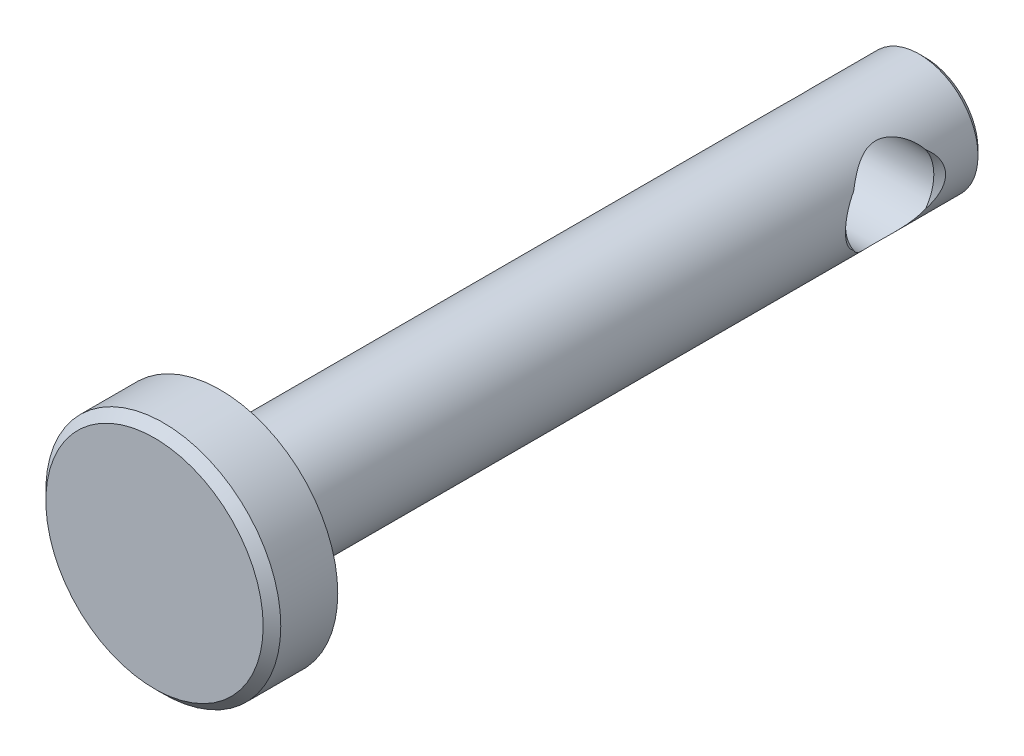
ISO-10303-21;
HEADER;
FILE_DESCRIPTION(('STEP AP214'),'2;1');
FILE_NAME('part.step','',(''),(''),'','','');
FILE_SCHEMA(('AUTOMOTIVE_DESIGN { 1 0 10303 214 1 1 1 1 }'));
ENDSEC;
DATA;
#1=APPLICATION_CONTEXT('core data for automotive mechanical design processes');
#2=APPLICATION_PROTOCOL_DEFINITION('international standard','automotive_design',2000,#1);
#3=PRODUCT_CONTEXT('',#1,'mechanical');
#4=PRODUCT('Part','Part','',(#3));
#5=PRODUCT_RELATED_PRODUCT_CATEGORY('part','',(#4));
#6=PRODUCT_DEFINITION_FORMATION('','',#4);
#7=PRODUCT_DEFINITION_CONTEXT('part definition',#1,'design');
#8=PRODUCT_DEFINITION('design','',#6,#7);
#9=PRODUCT_DEFINITION_SHAPE('','',#8);
#10=(LENGTH_UNIT() NAMED_UNIT(*) SI_UNIT(.MILLI.,.METRE.));
#11=(NAMED_UNIT(*) PLANE_ANGLE_UNIT() SI_UNIT($,.RADIAN.));
#12=(NAMED_UNIT(*) SI_UNIT($,.STERADIAN.) SOLID_ANGLE_UNIT());
#13=UNCERTAINTY_MEASURE_WITH_UNIT(LENGTH_MEASURE(1.E-05),#10,'distance_accuracy_value','');
#14=(GEOMETRIC_REPRESENTATION_CONTEXT(3) GLOBAL_UNCERTAINTY_ASSIGNED_CONTEXT((#13)) GLOBAL_UNIT_ASSIGNED_CONTEXT((#10,
#11,#12)) REPRESENTATION_CONTEXT('',''));
#15=CARTESIAN_POINT('',(0.,0.,0.));
#16=DIRECTION('',(0.,0.,1.));
#17=DIRECTION('',(1.,0.,0.));
#18=AXIS2_PLACEMENT_3D('',#15,#16,#17);
#19=CARTESIAN_POINT('',(0.,1.5875,8.636));
#20=DIRECTION('',(0.,0.,1.));
#21=DIRECTION('',(1.,0.,0.));
#22=AXIS2_PLACEMENT_3D('',#19,#20,#21);
#23=PLANE('',#22);
#24=CARTESIAN_POINT('',(0.,0.,8.636));
#25=DIRECTION('',(0.,0.,1.));
#26=DIRECTION('',(1.,0.,0.));
#27=AXIS2_PLACEMENT_3D('',#24,#25,#26);
#28=CIRCLE('',#27,1.7065625);
#29=CARTESIAN_POINT('',(1.7065625,0.,8.636));
#30=VERTEX_POINT('',#29);
#31=EDGE_CURVE('E121',#30,#30,#28,.T.);
#32=ORIENTED_EDGE('',*,*,#31,.T.);
#33=EDGE_LOOP('',(#32));
#34=FACE_BOUND('',#33,.T.);
#35=CARTESIAN_POINT('',(0.,0.,8.636));
#36=DIRECTION('',(0.,0.,1.));
#37=DIRECTION('',(1.,0.,0.));
#38=AXIS2_PLACEMENT_3D('',#35,#36,#37);
#39=CIRCLE('',#38,3.175);
#40=CARTESIAN_POINT('',(3.175,0.,8.636));
#41=VERTEX_POINT('',#40);
#42=EDGE_CURVE('E173',#41,#41,#39,.T.);
#43=ORIENTED_EDGE('',*,*,#42,.F.);
#44=EDGE_LOOP('',(#43));
#45=FACE_BOUND('',#44,.T.);
#46=ADVANCED_FACE('F43',(#34,#45),#23,.F.);
#47=CARTESIAN_POINT('',(0.,0.,10.414));
#48=DIRECTION('',(0.,0.,1.));
#49=DIRECTION('',(1.,0.,0.));
#50=AXIS2_PLACEMENT_3D('',#47,#48,#49);
#51=CYLINDRICAL_SURFACE('',#50,3.175);
#52=CARTESIAN_POINT('',(0.,0.,10.175875));
#53=DIRECTION('',(0.,0.,1.));
#54=DIRECTION('',(1.,0.,0.));
#55=AXIS2_PLACEMENT_3D('',#52,#53,#54);
#56=CIRCLE('',#55,3.175);
#57=CARTESIAN_POINT('',(3.175,0.,10.175875));
#58=VERTEX_POINT('',#57);
#59=EDGE_CURVE('E170',#58,#58,#56,.T.);
#60=ORIENTED_EDGE('',*,*,#59,.F.);
#61=EDGE_LOOP('',(#60));
#62=FACE_BOUND('',#61,.T.);
#63=ORIENTED_EDGE('',*,*,#42,.T.);
#64=EDGE_LOOP('',(#63));
#65=FACE_BOUND('',#64,.T.);
#66=ADVANCED_FACE('F194',(#62,#65),#51,.T.);
#67=CARTESIAN_POINT('',(0.,0.,10.175875));
#68=DIRECTION('',(0.,0.,-1.));
#69=DIRECTION('',(-1.,0.,0.));
#70=AXIS2_PLACEMENT_3D('',#67,#68,#69);
#71=CONICAL_SURFACE('',#70,3.175,0.78539816339745);
#72=CARTESIAN_POINT('',(0.,0.,10.414));
#73=DIRECTION('',(0.,0.,1.));
#74=DIRECTION('',(1.,0.,0.));
#75=AXIS2_PLACEMENT_3D('',#72,#73,#74);
#76=CIRCLE('',#75,2.936875);
#77=CARTESIAN_POINT('',(2.936875,0.,10.414));
#78=VERTEX_POINT('',#77);
#79=EDGE_CURVE('E166',#78,#78,#76,.T.);
#80=ORIENTED_EDGE('',*,*,#79,.F.);
#81=EDGE_LOOP('',(#80));
#82=FACE_BOUND('',#81,.T.);
#83=ORIENTED_EDGE('',*,*,#59,.T.);
#84=EDGE_LOOP('',(#83));
#85=FACE_BOUND('',#84,.T.);
#86=ADVANCED_FACE('F199',(#82,#85),#71,.T.);
#87=CARTESIAN_POINT('',(0.,2.936875,10.414));
#88=DIRECTION('',(0.,0.,-1.));
#89=DIRECTION('',(-1.,0.,0.));
#90=AXIS2_PLACEMENT_3D('',#87,#88,#89);
#91=PLANE('',#90);
#92=ORIENTED_EDGE('',*,*,#79,.T.);
#93=EDGE_LOOP('',(#92));
#94=FACE_BOUND('',#93,.T.);
#95=ADVANCED_FACE('F206',(#94),#91,.F.);
#96=CARTESIAN_POINT('',(0.,0.,-10.414));
#97=DIRECTION('',(0.,0.,1.));
#98=DIRECTION('',(1.,0.,0.));
#99=AXIS2_PLACEMENT_3D('',#96,#97,#98);
#100=PLANE('',#99);
#101=CARTESIAN_POINT('',(0.,0.,-10.414));
#102=DIRECTION('',(0.,0.,1.));
#103=DIRECTION('',(1.,0.,0.));
#104=AXIS2_PLACEMENT_3D('',#101,#102,#103);
#105=CIRCLE('',#104,1.42875);
#106=CARTESIAN_POINT('',(1.42875,0.,-10.414));
#107=VERTEX_POINT('',#106);
#108=EDGE_CURVE('E106',#107,#107,#105,.T.);
#109=ORIENTED_EDGE('',*,*,#108,.F.);
#110=EDGE_LOOP('',(#109));
#111=FACE_BOUND('',#110,.T.);
#112=ADVANCED_FACE('F210',(#111),#100,.F.);
#113=CARTESIAN_POINT('',(0.,0.,-10.414));
#114=DIRECTION('',(0.,0.,1.));
#115=DIRECTION('',(1.,0.,0.));
#116=AXIS2_PLACEMENT_3D('',#113,#114,#115);
#117=CONICAL_SURFACE('',#116,1.42875,0.78539816339745);
#118=CARTESIAN_POINT('',(0.,0.,-10.25525));
#119=DIRECTION('',(0.,0.,1.));
#120=DIRECTION('',(1.,0.,0.));
#121=AXIS2_PLACEMENT_3D('',#118,#119,#120);
#122=CIRCLE('',#121,1.5875);
#123=CARTESIAN_POINT('',(1.5875,0.,-10.25525));
#124=VERTEX_POINT('',#123);
#125=EDGE_CURVE('E101',#124,#124,#122,.T.);
#126=ORIENTED_EDGE('',*,*,#125,.F.);
#127=EDGE_LOOP('',(#126));
#128=FACE_BOUND('',#127,.T.);
#129=ORIENTED_EDGE('',*,*,#108,.T.);
#130=EDGE_LOOP('',(#129));
#131=FACE_BOUND('',#130,.T.);
#132=ADVANCED_FACE('F213',(#128,#131),#117,.T.);
#133=CARTESIAN_POINT('',(0.,0.,10.414));
#134=DIRECTION('',(0.,0.,1.));
#135=DIRECTION('',(1.,0.,0.));
#136=AXIS2_PLACEMENT_3D('',#133,#134,#135);
#137=CYLINDRICAL_SURFACE('',#136,1.5875);
#138=CARTESIAN_POINT('',(0.,0.,8.5169375));
#139=DIRECTION('',(0.,0.,1.));
#140=DIRECTION('',(1.,0.,0.));
#141=AXIS2_PLACEMENT_3D('',#138,#139,#140);
#142=CIRCLE('',#141,1.5875);
#143=CARTESIAN_POINT('',(1.5875,0.,8.5169375));
#144=VERTEX_POINT('',#143);
#145=EDGE_CURVE('E98',#144,#144,#142,.F.);
#146=ORIENTED_EDGE('',*,*,#145,.T.);
#147=EDGE_LOOP('',(#146));
#148=FACE_BOUND('',#147,.T.);
#149=CARTESIAN_POINT('',(1.5875,0.,-9.2202));
#150=CARTESIAN_POINT('',(1.58749611202196,-0.0582400089712499,-9.22019595126899));
#151=CARTESIAN_POINT('',(1.58426132337949,-0.11657109258843,-9.2159035448831));
#152=CARTESIAN_POINT('',(1.57161329724713,-0.231395079350689,-9.19900427951974));
#153=CARTESIAN_POINT('',(1.56218511689412,-0.287883189061273,-9.1863773112997));
#154=CARTESIAN_POINT('',(1.53805521874965,-0.397051087064886,-9.15366970328841));
#155=CARTESIAN_POINT('',(1.52338545829253,-0.449751678169738,-9.13363420719449));
#156=CARTESIAN_POINT('',(1.48987548341856,-0.550689971898322,-9.08705653326953));
#157=CARTESIAN_POINT('',(1.4710363761734,-0.598928854517485,-9.06051608263106));
#158=CARTESIAN_POINT('',(1.42848471386698,-0.6946800051158,-8.99908127379585));
#159=CARTESIAN_POINT('',(1.40448224261949,-0.741710122532747,-8.9636404849278));
#160=CARTESIAN_POINT('',(1.35445854154791,-0.829553943149394,-8.88687000646612));
#161=CARTESIAN_POINT('',(1.32843424535869,-0.870357914423511,-8.8455312892167));
#162=CARTESIAN_POINT('',(1.27068479738001,-0.953179932306108,-8.74853000227194));
#163=CARTESIAN_POINT('',(1.23888117921051,-0.993742907098832,-8.69166648702831));
#164=CARTESIAN_POINT('',(1.17827563549305,-1.06489206788819,-8.57053659887598));
#165=CARTESIAN_POINT('',(1.14946970080027,-1.09549169878323,-8.50628036187352));
#166=CARTESIAN_POINT('',(1.10835974170722,-1.13676501194143,-8.39403974300635));
#167=CARTESIAN_POINT('',(1.09379064722667,-1.1506712140752,-8.34808519536583));
#168=CARTESIAN_POINT('',(1.06983233223605,-1.17298121093543,-8.25359840345064));
#169=CARTESIAN_POINT('',(1.06043121477498,-1.1813976517873,-8.20507236388544));
#170=CARTESIAN_POINT('',(1.04829075745166,-1.19218967004259,-8.10602411547749));
#171=CARTESIAN_POINT('',(1.045613069014,-1.19450935132434,-8.05548771916016));
#172=CARTESIAN_POINT('',(1.04766413974654,-1.19270985237305,-7.95467152282419));
#173=CARTESIAN_POINT('',(1.0523953756061,-1.18858851900885,-7.90439181424972));
#174=CARTESIAN_POINT('',(1.06743533103032,-1.17508360539052,-7.81119140318832));
#175=CARTESIAN_POINT('',(1.07708192277861,-1.16632068351073,-7.76806484052093));
#176=CARTESIAN_POINT('',(1.10026903393579,-1.14447308122112,-7.68401397501192));
#177=CARTESIAN_POINT('',(1.11381333728094,-1.13138419928487,-7.64309185832182));
#178=CARTESIAN_POINT('',(1.15290197907028,-1.09185551143223,-7.53875648839986));
#179=CARTESIAN_POINT('',(1.18063622025076,-1.06219612507048,-7.4773835414864));
#180=CARTESIAN_POINT('',(1.23884845074039,-0.993702457646828,-7.36136751735191));
#181=CARTESIAN_POINT('',(1.26933302873675,-0.954845761924141,-7.30674138563403));
#182=CARTESIAN_POINT('',(1.33071770954226,-0.867340615100043,-7.20324517466848));
#183=CARTESIAN_POINT('',(1.36160815500153,-0.818464823163803,-7.15456060007206));
#184=CARTESIAN_POINT('',(1.42018729468899,-0.711972733099049,-7.0656470556378));
#185=CARTESIAN_POINT('',(1.44788202748534,-0.654373411630238,-7.0254020168846));
#186=CARTESIAN_POINT('',(1.49255937974569,-0.543375678884244,-6.96191225720353));
#187=CARTESIAN_POINT('',(1.51057698528298,-0.491421390850431,-6.93687826342951));
#188=CARTESIAN_POINT('',(1.54160267629901,-0.383120959812397,-6.89425356935758));
#189=CARTESIAN_POINT('',(1.55461387180883,-0.326777569607643,-6.87665824741071));
#190=CARTESIAN_POINT('',(1.57456526025464,-0.210682235925699,-6.84982044867307));
#191=CARTESIAN_POINT('',(1.58146728549932,-0.150911313378105,-6.84063047346514));
#192=CARTESIAN_POINT('',(1.58835864577547,-0.0302752509871145,-6.83145425719974));
#193=CARTESIAN_POINT('',(1.58835103325544,0.030589393802899,-6.83146395203366));
#194=CARTESIAN_POINT('',(1.58179458772454,0.1450181185284,-6.8401950465413));
#195=CARTESIAN_POINT('',(1.57591384970658,0.19869298501823,-6.84802667096197));
#196=CARTESIAN_POINT('',(1.55908265824008,0.303723073443524,-6.87063283096421));
#197=CARTESIAN_POINT('',(1.54813114648294,0.355077808693233,-6.88540881589571));
#198=CARTESIAN_POINT('',(1.52151176197059,0.456045209324179,-6.92179181647819));
#199=CARTESIAN_POINT('',(1.50569808574506,0.505541757920198,-6.94361122968309));
#200=CARTESIAN_POINT('',(1.47055050484394,0.600156812323758,-6.99304500560874));
#201=CARTESIAN_POINT('',(1.45121610643685,0.645274702724317,-7.02066018118617));
#202=CARTESIAN_POINT('',(1.40668133727199,0.73787711046835,-7.08596374763362));
#203=CARTESIAN_POINT('',(1.38104027666391,0.784504868153515,-7.12456377637796));
#204=CARTESIAN_POINT('',(1.32814791913206,0.871068853718403,-7.20785561536308));
#205=CARTESIAN_POINT('',(1.30089319575511,0.910990097537656,-7.25256067248153));
#206=CARTESIAN_POINT('',(1.24150416985764,0.99082826486013,-7.35668225605029));
#207=CARTESIAN_POINT('',(1.20943783950672,1.02927233640271,-7.41727531880507));
#208=CARTESIAN_POINT('',(1.14994929880445,1.09532583053487,-7.54615948433145));
#209=CARTESIAN_POINT('',(1.12251399992912,1.12296608908655,-7.6144279512821));
#210=CARTESIAN_POINT('',(1.08675452907574,1.15736064850765,-7.73013915267305));
#211=CARTESIAN_POINT('',(1.07514574754346,1.16805755109583,-7.77538061837333));
#212=CARTESIAN_POINT('',(1.05740659988992,1.18414258325224,-7.86779964886528));
#213=CARTESIAN_POINT('',(1.05126379878151,1.18954276562459,-7.91497256237221));
#214=CARTESIAN_POINT('',(1.04546055627039,1.19464934449511,-8.01030578195791));
#215=CARTESIAN_POINT('',(1.04583560652376,1.19432456673064,-8.05847006675175));
#216=CARTESIAN_POINT('',(1.05308483711194,1.18793443725808,-8.15394137853598));
#217=CARTESIAN_POINT('',(1.05996708886521,1.18186195618975,-8.20124726650406));
#218=CARTESIAN_POINT('',(1.08105685565804,1.16263091032964,-8.30330860189891));
#219=CARTESIAN_POINT('',(1.09648769678382,1.14826379093168,-8.35757395089954));
#220=CARTESIAN_POINT('',(1.13243372364885,1.11282760223121,-8.46210253452145));
#221=CARTESIAN_POINT('',(1.15296179012186,1.09174151519866,-8.51235519721814));
#222=CARTESIAN_POINT('',(1.20451193671736,1.03501018570489,-8.62576996395814));
#223=CARTESIAN_POINT('',(1.23666801369922,0.996854275300433,-8.68715774854217));
#224=CARTESIAN_POINT('',(1.30163587572989,0.910405116618211,-8.80195536893352));
#225=CARTESIAN_POINT('',(1.33444825342698,0.862102293520954,-8.85535758734926));
#226=CARTESIAN_POINT('',(1.39773998562555,0.755232813325329,-8.95381974105773));
#227=CARTESIAN_POINT('',(1.42819461464791,0.69657427501949,-8.99879687060098));
#228=CARTESIAN_POINT('',(1.48324162953063,0.569981739920326,-9.07797688846189));
#229=CARTESIAN_POINT('',(1.50784795580836,0.502070419774359,-9.11220546169502));
#230=CARTESIAN_POINT('',(1.54233051377999,0.379688308077726,-9.1595203293115));
#231=CARTESIAN_POINT('',(1.55440989792483,0.327083173676254,-9.17586169968433));
#232=CARTESIAN_POINT('',(1.57322723786403,0.219278478888826,-9.20118501708733));
#233=CARTESIAN_POINT('',(1.57997976971978,0.164086439239056,-9.21018704929824));
#234=CARTESIAN_POINT('',(1.58502674119598,0.0904161718022083,-9.21690930618343));
#235=CARTESIAN_POINT('',(1.58595256159585,0.0723713822538822,-9.21814159894565));
#236=CARTESIAN_POINT('',(1.58718985023469,0.0362206722883149,-9.21978764823282));
#237=CARTESIAN_POINT('',(1.58750120930128,0.0181147415803484,-9.22020125930125));
#238=CARTESIAN_POINT('',(1.5875,0.,-9.2202));
#239=B_SPLINE_CURVE_WITH_KNOTS('',3,(#149,#150,#151,#152,#153,#154,#155,#156,#157,#158,#159,
#160,#161,#162,#163,#164,#165,#166,#167,#168,#169,#170,#171,#172,#173,#174,#175,#176,#177,#178,
#179,#180,#181,#182,#183,#184,#185,#186,#187,#188,#189,#190,#191,#192,#193,#194,#195,#196,#197,
#198,#199,#200,#201,#202,#203,#204,#205,#206,#207,#208,#209,#210,#211,#212,#213,#214,#215,#216,
#217,#218,#219,#220,#221,#222,#223,#224,#225,#226,#227,#228,#229,#230,#231,#232,#233,#234,#235,
#236,#237,#238),.UNSPECIFIED.,.T.,.F.,(4,2,2,2,2,2,2,2,2,2,2,2,2,2,2,2,2,2,2,2,2,2,2,2,2,2,2,2,
2,2,2,2,2,2,2,2,2,2,2,2,2,2,2,2,4),(0.,0.1746409477453,0.349704808862343,0.523719044210978,
0.697687125338504,0.887786772593079,1.07818058109092,1.30747198334326,1.53645267659189,
1.68647155013404,1.83614361058132,1.98718317892457,2.13827324824999,2.27294091295011,
2.40773975793311,2.62731202673711,2.84742502470235,3.07323328607394,3.29860762349453,
3.47914313832493,3.65956632095647,3.84110891835788,4.02257131630786,4.18550204838064,
4.34846680066057,4.51689478880588,4.68534641481021,4.88184568379422,5.0787783058004,
5.31352668791231,5.54760007750781,5.69082209572997,5.83371744771565,5.97739115040064,
6.12124329753643,6.29493375520328,6.46906767851779,6.70520286421156,6.94156188058405,
7.18013431619471,7.4181322390808,7.58663566986344,7.75467640351593,7.80898638330886,
7.86330601157875),.UNSPECIFIED.);
#240=CARTESIAN_POINT('',(1.42875,0.691975207287083,-7.05360569877286));
#241=VERTEX_POINT('',#240);
#242=CARTESIAN_POINT('',(1.42875,0.691975207287082,-8.99919430122714));
#243=VERTEX_POINT('',#242);
#244=EDGE_CURVE('E90',#241,#243,#239,.T.);
#245=ORIENTED_EDGE('',*,*,#244,.T.);
#246=CARTESIAN_POINT('',(1.23805,0.99367421597825,-8.16359024199999));
#247=CARTESIAN_POINT('',(1.24053479299915,0.990561992498934,-8.20440734850049));
#248=CARTESIAN_POINT('',(1.2441425338152,0.986059358589298,-8.24503861171192));
#249=CARTESIAN_POINT('',(1.25337551549325,0.974305043081676,-8.32564783894813));
#250=CARTESIAN_POINT('',(1.25899964864874,0.967054870721417,-8.36562614909022));
#251=CARTESIAN_POINT('',(1.2720632338086,0.949803410437431,-8.444832611098));
#252=CARTESIAN_POINT('',(1.27950901724791,0.939792511392553,-8.48405762055221));
#253=CARTESIAN_POINT('',(1.2959063015909,0.917049144683471,-8.56138220444965));
#254=CARTESIAN_POINT('',(1.30485801055266,0.904316300890558,-8.59948162252539));
#255=CARTESIAN_POINT('',(1.33388751121047,0.861460718248394,-8.71330215359363));
#256=CARTESIAN_POINT('',(1.35585971379744,0.827017715052386,-8.78697179690659));
#257=CARTESIAN_POINT('',(1.40187913290999,0.746354920923548,-8.92676322308597));
#258=CARTESIAN_POINT('',(1.42592241013582,0.700157174722621,-8.99289880278171));
#259=CARTESIAN_POINT('',(1.46470756983128,0.613345236834446,-9.09346154211261));
#260=CARTESIAN_POINT('',(1.47977482652536,0.576381892481274,-9.13091438393773));
#261=CARTESIAN_POINT('',(1.5083472477474,0.496814961423421,-9.19997493601643));
#262=CARTESIAN_POINT('',(1.52185516605578,0.454221611818577,-9.2315930114423));
#263=CARTESIAN_POINT('',(1.54348135864228,0.373084585248218,-9.28128315667358));
#264=CARTESIAN_POINT('',(1.55213553893219,0.335579232612301,-9.30080571232605));
#265=CARTESIAN_POINT('',(1.56696839012256,0.257561295817283,-9.3339442826682));
#266=CARTESIAN_POINT('',(1.57314884324639,0.217050901705495,-9.34756455031194));
#267=CARTESIAN_POINT('',(1.58242849384137,0.133600951511006,-9.36792321159513));
#268=CARTESIAN_POINT('',(1.58550216649288,0.0906442874120377,-9.3746046086592));
#269=CARTESIAN_POINT('',(1.58808311847929,0.00412619278132048,-9.38021920319223));
#270=CARTESIAN_POINT('',(1.58759245464917,-0.0394348744896154,-9.37915686925512));
#271=CARTESIAN_POINT('',(1.58340567028437,-0.120014186274123,-9.370036274291));
#272=CARTESIAN_POINT('',(1.58012364924782,-0.157162001760674,-9.36288165052934));
#273=CARTESIAN_POINT('',(1.5712152139674,-0.229733812029094,-9.343298459379));
#274=CARTESIAN_POINT('',(1.56558782996527,-0.265157086975513,-9.33086771038432));
#275=CARTESIAN_POINT('',(1.55026222903822,-0.344953642531649,-9.29660939891668));
#276=CARTESIAN_POINT('',(1.53983375428182,-0.388434583195283,-9.27303557810789));
#277=CARTESIAN_POINT('',(1.51672710854084,-0.470670026966886,-9.21959099874607));
#278=CARTESIAN_POINT('',(1.50404434576086,-0.509414605373221,-9.189707363832));
#279=CARTESIAN_POINT('',(1.47207383811032,-0.596745387597107,-9.11206920448683));
#280=CARTESIAN_POINT('',(1.4521829674411,-0.643011881018498,-9.06196417152487));
#281=CARTESIAN_POINT('',(1.41219513646592,-0.726646137903302,-8.95490363121355));
#282=CARTESIAN_POINT('',(1.39209788103945,-0.763998492116009,-8.89793651393417));
#283=CARTESIAN_POINT('',(1.35291203350376,-0.831478590652449,-8.77677067440056));
#284=CARTESIAN_POINT('',(1.33388222248223,-0.861312375890783,-8.7123901822693));
#285=CARTESIAN_POINT('',(1.29955246389209,-0.912284746020732,-8.57945607893249));
#286=CARTESIAN_POINT('',(1.28424586971825,-0.933438872728984,-8.51091018132648));
#287=CARTESIAN_POINT('',(1.2635566468812,-0.961127420898014,-8.39566617123315));
#288=CARTESIAN_POINT('',(1.2565798413002,-0.970185965731905,-8.34984538595897));
#289=CARTESIAN_POINT('',(1.24525368049968,-0.984667998738119,-8.25730091713307));
#290=CARTESIAN_POINT('',(1.24090515542,-0.990090338477764,-8.21057695311698));
#291=CARTESIAN_POINT('',(1.23805,-0.99367421597825,-8.16359024199999));
#292=B_SPLINE_CURVE_WITH_KNOTS('',3,(#246,#247,#248,#249,#250,#251,#252,#253,#254,#255,#256,
#257,#258,#259,#260,#261,#262,#263,#264,#265,#266,#267,#268,#269,#270,#271,#272,#273,#274,#275,
#276,#277,#278,#279,#280,#281,#282,#283,#284,#285,#286,#287,#288,#289,#290,#291),.UNSPECIFIED.,
.F.,.F.,(4,2,2,2,2,2,2,2,2,2,2,2,2,2,2,2,2,2,2,2,2,2,4),(0.,0.122976704234101,0.245885954386525,
0.369228620189027,0.492588340981634,0.744152320056387,0.995247951710536,1.15896993556556,
1.3223982152019,1.45138415820396,1.58027700389274,1.71022040991761,1.84008883679757,
1.9534993629398,2.06695682854497,2.21776266025168,2.36887926646994,2.58084932511506,
2.793183189702,3.01284801813061,3.23211777938468,3.3735893575406,3.51510559603774),.UNSPECIFIED.);
#293=CARTESIAN_POINT('',(1.42875,-0.691975207287083,-8.99919430122714));
#294=VERTEX_POINT('',#293);
#295=EDGE_CURVE('E58',#243,#294,#292,.T.);
#296=ORIENTED_EDGE('',*,*,#295,.T.);
#297=CARTESIAN_POINT('',(1.42875000000295,-0.691975207290344,-7.05360569876992));
#298=VERTEX_POINT('',#297);
#299=EDGE_CURVE('E88',#294,#298,#239,.T.);
#300=ORIENTED_EDGE('',*,*,#299,.T.);
#301=CARTESIAN_POINT('',(1.23805000000001,-0.993674215978242,-7.8892097579999));
#302=CARTESIAN_POINT('',(1.24053479299916,-0.990561992498923,-7.8483926514994));
#303=CARTESIAN_POINT('',(1.24414253381521,-0.986059358589284,-7.80776138828796));
#304=CARTESIAN_POINT('',(1.25337551549327,-0.974305043081657,-7.72715216105176));
#305=CARTESIAN_POINT('',(1.25899964864876,-0.967054870721395,-7.68717385090966));
#306=CARTESIAN_POINT('',(1.27206323380863,-0.949803410437403,-7.60796738890188));
#307=CARTESIAN_POINT('',(1.27950901724793,-0.939792511392522,-7.56874237944768));
#308=CARTESIAN_POINT('',(1.29590630159093,-0.917049144683434,-7.49141779555023));
#309=CARTESIAN_POINT('',(1.30485801055269,-0.904316300890518,-7.4533183774745));
#310=CARTESIAN_POINT('',(1.33388751121051,-0.861460718248345,-7.33949784640626));
#311=CARTESIAN_POINT('',(1.35585971379748,-0.827017715052329,-7.2658282030933));
#312=CARTESIAN_POINT('',(1.40187913291003,-0.746354920923477,-7.12603677691393));
#313=CARTESIAN_POINT('',(1.42592241013586,-0.700157174722543,-7.05990119721819));
#314=CARTESIAN_POINT('',(1.46470756983131,-0.613345236834359,-6.9593384578873));
#315=CARTESIAN_POINT('',(1.47977482652539,-0.576381892481187,-6.92188561606218));
#316=CARTESIAN_POINT('',(1.50834724774743,-0.496814961423337,-6.8528250639835));
#317=CARTESIAN_POINT('',(1.52185516605581,-0.454221611818495,-6.82120698855764));
#318=CARTESIAN_POINT('',(1.5434813586423,-0.373084585248139,-6.77151684332637));
#319=CARTESIAN_POINT('',(1.5521355389322,-0.335579232612222,-6.75199428767391));
#320=CARTESIAN_POINT('',(1.56696839012257,-0.257561295817205,-6.71885571733177));
#321=CARTESIAN_POINT('',(1.5731488432464,-0.217050901705419,-6.70523544968803));
#322=CARTESIAN_POINT('',(1.58242849384138,-0.133600951510932,-6.68487678840486));
#323=CARTESIAN_POINT('',(1.58550216649288,-0.090644287411966,-6.67819539134079));
#324=CARTESIAN_POINT('',(1.58808311847929,-0.00412619278125399,-6.67258079680777));
#325=CARTESIAN_POINT('',(1.58759245464917,0.0394348744896788,-6.67364313074488));
#326=CARTESIAN_POINT('',(1.58340567028437,0.120014186274182,-6.68276372570901));
#327=CARTESIAN_POINT('',(1.58012364924781,0.157162001760732,-6.68991834947067));
#328=CARTESIAN_POINT('',(1.57121521396739,0.229733812029149,-6.70950154062102));
#329=CARTESIAN_POINT('',(1.56558782996526,0.265157086975566,-6.7219322896157));
#330=CARTESIAN_POINT('',(1.55026222903821,0.344953642531702,-6.75619060108334));
#331=CARTESIAN_POINT('',(1.53983375428181,0.388434583195337,-6.77976442189214));
#332=CARTESIAN_POINT('',(1.51672710854082,0.470670026966941,-6.83320900125397));
#333=CARTESIAN_POINT('',(1.50404434576084,0.509414605373276,-6.86309263616804));
#334=CARTESIAN_POINT('',(1.4720738381103,0.596745387597162,-6.94073079551323));
#335=CARTESIAN_POINT('',(1.45218296744108,0.643011881018554,-6.99083582847519));
#336=CARTESIAN_POINT('',(1.4121951364659,0.726646137903356,-7.09789636878652));
#337=CARTESIAN_POINT('',(1.39209788103942,0.763998492116062,-7.15486348606591));
#338=CARTESIAN_POINT('',(1.35291203350373,0.831478590652498,-7.27602932559954));
#339=CARTESIAN_POINT('',(1.3338822224822,0.861312375890829,-7.3404098177308));
#340=CARTESIAN_POINT('',(1.29955246389206,0.912284746020772,-7.47334392106763));
#341=CARTESIAN_POINT('',(1.28424586971822,0.93343887272902,-7.54188981867364));
#342=CARTESIAN_POINT('',(1.26355664688118,0.961127420898032,-7.65713382876695));
#343=CARTESIAN_POINT('',(1.25657984130019,0.970185965731914,-7.70295461404108));
#344=CARTESIAN_POINT('',(1.24525368049968,0.984667998738114,-7.7954990828669));
#345=CARTESIAN_POINT('',(1.24090515542001,0.990090338477756,-7.84222304688295));
#346=CARTESIAN_POINT('',(1.23805000000001,0.993674215978242,-7.8892097579999));
#347=B_SPLINE_CURVE_WITH_KNOTS('',3,(#301,#302,#303,#304,#305,#306,#307,#308,#309,#310,#311,
#312,#313,#314,#315,#316,#317,#318,#319,#320,#321,#322,#323,#324,#325,#326,#327,#328,#329,#330,
#331,#332,#333,#334,#335,#336,#337,#338,#339,#340,#341,#342,#343,#344,#345,#346),.UNSPECIFIED.,
.F.,.F.,(4,2,2,2,2,2,2,2,2,2,2,2,2,2,2,2,2,2,2,2,2,2,4),(0.,0.122976704234104,0.245885954386531,
0.369228620189035,0.492588340981645,0.744152320056406,0.995247951710561,1.15896993556556,
1.32239821520188,1.45138415820393,1.5802770038927,1.71022040991757,1.84008883679752,
1.95349936293975,2.06695682854491,2.21776266025163,2.3688792664699,2.58084932511504,
2.793183189702,3.01284801813062,3.2321177793847,3.3735893575405,3.51510559603751),.UNSPECIFIED.);
#348=EDGE_CURVE('E65',#298,#241,#347,.T.);
#349=ORIENTED_EDGE('',*,*,#348,.T.);
#350=EDGE_LOOP('',(#245,#296,#300,#349));
#351=FACE_BOUND('',#350,.T.);
#352=CARTESIAN_POINT('',(-1.5875,0.,-9.2202));
#353=CARTESIAN_POINT('',(-1.58749611202196,0.0582400089712499,-9.22019595126899));
#354=CARTESIAN_POINT('',(-1.58426132337949,0.11657109258843,-9.2159035448831));
#355=CARTESIAN_POINT('',(-1.57161329724713,0.231395079350689,-9.19900427951974));
#356=CARTESIAN_POINT('',(-1.56218511689412,0.287883189061273,-9.1863773112997));
#357=CARTESIAN_POINT('',(-1.53805521874965,0.397051087064886,-9.15366970328841));
#358=CARTESIAN_POINT('',(-1.52338545829253,0.449751678169738,-9.13363420719449));
#359=CARTESIAN_POINT('',(-1.48987548341856,0.550689971898322,-9.08705653326953));
#360=CARTESIAN_POINT('',(-1.4710363761734,0.598928854517485,-9.06051608263106));
#361=CARTESIAN_POINT('',(-1.42848471386698,0.6946800051158,-8.99908127379585));
#362=CARTESIAN_POINT('',(-1.40448224261949,0.741710122532747,-8.9636404849278));
#363=CARTESIAN_POINT('',(-1.35445854154791,0.829553943149394,-8.88687000646612));
#364=CARTESIAN_POINT('',(-1.32843424535869,0.870357914423511,-8.8455312892167));
#365=CARTESIAN_POINT('',(-1.27068479738001,0.953179932306108,-8.74853000227194));
#366=CARTESIAN_POINT('',(-1.23888117921051,0.993742907098832,-8.69166648702831));
#367=CARTESIAN_POINT('',(-1.17827563549305,1.06489206788819,-8.57053659887598));
#368=CARTESIAN_POINT('',(-1.14946970080027,1.09549169878323,-8.50628036187352));
#369=CARTESIAN_POINT('',(-1.10835974170722,1.13676501194143,-8.39403974300635));
#370=CARTESIAN_POINT('',(-1.09379064722667,1.1506712140752,-8.34808519536583));
#371=CARTESIAN_POINT('',(-1.06983233223605,1.17298121093543,-8.25359840345064));
#372=CARTESIAN_POINT('',(-1.06043121477498,1.1813976517873,-8.20507236388544));
#373=CARTESIAN_POINT('',(-1.04829075745166,1.19218967004259,-8.10602411547749));
#374=CARTESIAN_POINT('',(-1.045613069014,1.19450935132434,-8.05548771916016));
#375=CARTESIAN_POINT('',(-1.04766413974654,1.19270985237305,-7.95467152282419));
#376=CARTESIAN_POINT('',(-1.0523953756061,1.18858851900885,-7.90439181424972));
#377=CARTESIAN_POINT('',(-1.06743533103032,1.17508360539052,-7.81119140318832));
#378=CARTESIAN_POINT('',(-1.07708192277861,1.16632068351073,-7.76806484052093));
#379=CARTESIAN_POINT('',(-1.10026903393579,1.14447308122112,-7.68401397501192));
#380=CARTESIAN_POINT('',(-1.11381333728094,1.13138419928487,-7.64309185832182));
#381=CARTESIAN_POINT('',(-1.15290197907028,1.09185551143223,-7.53875648839986));
#382=CARTESIAN_POINT('',(-1.18063622025076,1.06219612507048,-7.4773835414864));
#383=CARTESIAN_POINT('',(-1.23884845074039,0.993702457646828,-7.36136751735191));
#384=CARTESIAN_POINT('',(-1.26933302873675,0.954845761924141,-7.30674138563403));
#385=CARTESIAN_POINT('',(-1.33071770954226,0.867340615100043,-7.20324517466848));
#386=CARTESIAN_POINT('',(-1.36160815500153,0.818464823163803,-7.15456060007206));
#387=CARTESIAN_POINT('',(-1.42018729468899,0.711972733099049,-7.0656470556378));
#388=CARTESIAN_POINT('',(-1.44788202748534,0.654373411630238,-7.0254020168846));
#389=CARTESIAN_POINT('',(-1.49255937974569,0.543375678884244,-6.96191225720353));
#390=CARTESIAN_POINT('',(-1.51057698528298,0.491421390850431,-6.93687826342951));
#391=CARTESIAN_POINT('',(-1.54160267629901,0.383120959812397,-6.89425356935758));
#392=CARTESIAN_POINT('',(-1.55461387180883,0.326777569607643,-6.87665824741071));
#393=CARTESIAN_POINT('',(-1.57456526025464,0.210682235925699,-6.84982044867307));
#394=CARTESIAN_POINT('',(-1.58146728549932,0.150911313378105,-6.84063047346514));
#395=CARTESIAN_POINT('',(-1.58835864577547,0.0302752509871145,-6.83145425719974));
#396=CARTESIAN_POINT('',(-1.58835103325544,-0.030589393802899,-6.83146395203366));
#397=CARTESIAN_POINT('',(-1.58179458772454,-0.1450181185284,-6.8401950465413));
#398=CARTESIAN_POINT('',(-1.57591384970658,-0.19869298501823,-6.84802667096197));
#399=CARTESIAN_POINT('',(-1.55908265824008,-0.303723073443524,-6.87063283096421));
#400=CARTESIAN_POINT('',(-1.54813114648294,-0.355077808693233,-6.88540881589571));
#401=CARTESIAN_POINT('',(-1.52151176197059,-0.456045209324179,-6.92179181647819));
#402=CARTESIAN_POINT('',(-1.50569808574506,-0.505541757920198,-6.94361122968309));
#403=CARTESIAN_POINT('',(-1.47055050484394,-0.600156812323758,-6.99304500560874));
#404=CARTESIAN_POINT('',(-1.45121610643685,-0.645274702724317,-7.02066018118617));
#405=CARTESIAN_POINT('',(-1.40668133727199,-0.73787711046835,-7.08596374763362));
#406=CARTESIAN_POINT('',(-1.38104027666391,-0.784504868153515,-7.12456377637796));
#407=CARTESIAN_POINT('',(-1.32814791913206,-0.871068853718403,-7.20785561536308));
#408=CARTESIAN_POINT('',(-1.30089319575511,-0.910990097537656,-7.25256067248153));
#409=CARTESIAN_POINT('',(-1.24150416985764,-0.99082826486013,-7.35668225605029));
#410=CARTESIAN_POINT('',(-1.20943783950672,-1.02927233640271,-7.41727531880507));
#411=CARTESIAN_POINT('',(-1.14994929880445,-1.09532583053487,-7.54615948433145));
#412=CARTESIAN_POINT('',(-1.12251399992912,-1.12296608908655,-7.6144279512821));
#413=CARTESIAN_POINT('',(-1.08675452907574,-1.15736064850765,-7.73013915267305));
#414=CARTESIAN_POINT('',(-1.07514574754346,-1.16805755109583,-7.77538061837333));
#415=CARTESIAN_POINT('',(-1.05740659988992,-1.18414258325224,-7.86779964886528));
#416=CARTESIAN_POINT('',(-1.05126379878151,-1.18954276562459,-7.91497256237221));
#417=CARTESIAN_POINT('',(-1.04546055627039,-1.19464934449511,-8.01030578195791));
#418=CARTESIAN_POINT('',(-1.04583560652376,-1.19432456673064,-8.05847006675175));
#419=CARTESIAN_POINT('',(-1.05308483711194,-1.18793443725808,-8.15394137853598));
#420=CARTESIAN_POINT('',(-1.05996708886521,-1.18186195618975,-8.20124726650406));
#421=CARTESIAN_POINT('',(-1.08105685565804,-1.16263091032964,-8.30330860189891));
#422=CARTESIAN_POINT('',(-1.09648769678382,-1.14826379093168,-8.35757395089954));
#423=CARTESIAN_POINT('',(-1.13243372364885,-1.11282760223121,-8.46210253452145));
#424=CARTESIAN_POINT('',(-1.15296179012186,-1.09174151519866,-8.51235519721814));
#425=CARTESIAN_POINT('',(-1.20451193671736,-1.03501018570489,-8.62576996395814));
#426=CARTESIAN_POINT('',(-1.23666801369922,-0.996854275300433,-8.68715774854217));
#427=CARTESIAN_POINT('',(-1.30163587572989,-0.910405116618211,-8.80195536893352));
#428=CARTESIAN_POINT('',(-1.33444825342698,-0.862102293520954,-8.85535758734926));
#429=CARTESIAN_POINT('',(-1.39773998562555,-0.755232813325329,-8.95381974105773));
#430=CARTESIAN_POINT('',(-1.42819461464791,-0.69657427501949,-8.99879687060098));
#431=CARTESIAN_POINT('',(-1.48324162953063,-0.569981739920326,-9.07797688846189));
#432=CARTESIAN_POINT('',(-1.50784795580836,-0.502070419774359,-9.11220546169502));
#433=CARTESIAN_POINT('',(-1.54233051377999,-0.379688308077726,-9.1595203293115));
#434=CARTESIAN_POINT('',(-1.55440989792483,-0.327083173676254,-9.17586169968433));
#435=CARTESIAN_POINT('',(-1.57322723786403,-0.219278478888826,-9.20118501708733));
#436=CARTESIAN_POINT('',(-1.57997976971978,-0.164086439239056,-9.21018704929824));
#437=CARTESIAN_POINT('',(-1.58502674119598,-0.0904161718022083,-9.21690930618343));
#438=CARTESIAN_POINT('',(-1.58595256159585,-0.0723713822538822,-9.21814159894565));
#439=CARTESIAN_POINT('',(-1.58718985023469,-0.0362206722883149,-9.21978764823282));
#440=CARTESIAN_POINT('',(-1.58750120930128,-0.0181147415803484,-9.22020125930125));
#441=CARTESIAN_POINT('',(-1.5875,0.,-9.2202));
#442=B_SPLINE_CURVE_WITH_KNOTS('',3,(#352,#353,#354,#355,#356,#357,#358,#359,#360,#361,#362,
#363,#364,#365,#366,#367,#368,#369,#370,#371,#372,#373,#374,#375,#376,#377,#378,#379,#380,#381,
#382,#383,#384,#385,#386,#387,#388,#389,#390,#391,#392,#393,#394,#395,#396,#397,#398,#399,#400,
#401,#402,#403,#404,#405,#406,#407,#408,#409,#410,#411,#412,#413,#414,#415,#416,#417,#418,#419,
#420,#421,#422,#423,#424,#425,#426,#427,#428,#429,#430,#431,#432,#433,#434,#435,#436,#437,#438,
#439,#440,#441),.UNSPECIFIED.,.T.,.F.,(4,2,2,2,2,2,2,2,2,2,2,2,2,2,2,2,2,2,2,2,2,2,2,2,2,2,2,2,
2,2,2,2,2,2,2,2,2,2,2,2,2,2,2,2,4),(0.,0.1746409477453,0.349704808862343,0.523719044210978,
0.697687125338504,0.887786772593079,1.07818058109092,1.30747198334326,1.53645267659189,
1.68647155013404,1.83614361058132,1.98718317892457,2.13827324824999,2.27294091295011,
2.40773975793311,2.62731202673711,2.84742502470235,3.07323328607394,3.29860762349453,
3.47914313832493,3.65956632095647,3.84110891835788,4.02257131630786,4.18550204838064,
4.34846680066057,4.51689478880588,4.68534641481021,4.88184568379422,5.0787783058004,
5.31352668791231,5.54760007750781,5.69082209572997,5.83371744771565,5.97739115040064,
6.12124329753643,6.29493375520328,6.46906767851779,6.70520286421156,6.94156188058405,
7.18013431619471,7.4181322390808,7.58663566986344,7.75467640351593,7.80898638330886,
7.86330601157875),.UNSPECIFIED.);
#443=CARTESIAN_POINT('',(-1.42875,0.691975207287085,-8.99919430122714));
#444=VERTEX_POINT('',#443);
#445=CARTESIAN_POINT('',(-1.42875000000295,0.691975207290346,-7.05360569876992));
#446=VERTEX_POINT('',#445);
#447=EDGE_CURVE('E108',#444,#446,#442,.T.);
#448=ORIENTED_EDGE('',*,*,#447,.T.);
#449=CARTESIAN_POINT('',(-1.23805000000001,0.993674215978243,-7.8892097579999));
#450=CARTESIAN_POINT('',(-1.24053479299916,0.990561992498924,-7.84839265149941));
#451=CARTESIAN_POINT('',(-1.24414253381521,0.986059358589286,-7.80776138828797));
#452=CARTESIAN_POINT('',(-1.25337551549326,0.974305043081658,-7.72715216105177));
#453=CARTESIAN_POINT('',(-1.25899964864876,0.967054870721396,-7.68717385090967));
#454=CARTESIAN_POINT('',(-1.27206323380862,0.949803410437405,-7.60796738890189));
#455=CARTESIAN_POINT('',(-1.27950901724793,0.939792511392525,-7.56874237944769));
#456=CARTESIAN_POINT('',(-1.29590630159092,0.917049144683437,-7.49141779555024));
#457=CARTESIAN_POINT('',(-1.30485801055268,0.90431630089052,-7.4533183774745));
#458=CARTESIAN_POINT('',(-1.3338875112105,0.861460718248348,-7.33949784640626));
#459=CARTESIAN_POINT('',(-1.35585971379747,0.827017715052333,-7.26582820309331));
#460=CARTESIAN_POINT('',(-1.40187913291003,0.746354920923481,-7.12603677691393));
#461=CARTESIAN_POINT('',(-1.42592241013586,0.700157174722548,-7.05990119721819));
#462=CARTESIAN_POINT('',(-1.46470756983131,0.613345236834364,-6.95933845788731));
#463=CARTESIAN_POINT('',(-1.47977482652539,0.576381892481192,-6.92188561606219));
#464=CARTESIAN_POINT('',(-1.50834724774743,0.496814961423341,-6.85282506398351));
#465=CARTESIAN_POINT('',(-1.5218551660558,0.4542216118185,-6.82120698855764));
#466=CARTESIAN_POINT('',(-1.54348135864229,0.373084585248143,-6.77151684332637));
#467=CARTESIAN_POINT('',(-1.5521355389322,0.335579232612227,-6.75199428767391));
#468=CARTESIAN_POINT('',(-1.56696839012257,0.25756129581721,-6.71885571733177));
#469=CARTESIAN_POINT('',(-1.5731488432464,0.217050901705423,-6.70523544968803));
#470=CARTESIAN_POINT('',(-1.58242849384138,0.133600951510936,-6.68487678840486));
#471=CARTESIAN_POINT('',(-1.58550216649288,0.0906442874119699,-6.67819539134079));
#472=CARTESIAN_POINT('',(-1.58808311847929,0.00412619278125776,-6.67258079680777));
#473=CARTESIAN_POINT('',(-1.58759245464917,-0.0394348744896752,-6.67364313074488));
#474=CARTESIAN_POINT('',(-1.58340567028437,-0.120014186274179,-6.68276372570901));
#475=CARTESIAN_POINT('',(-1.58012364924782,-0.157162001760729,-6.68991834947067));
#476=CARTESIAN_POINT('',(-1.5712152139674,-0.229733812029146,-6.70950154062102));
#477=CARTESIAN_POINT('',(-1.56558782996526,-0.265157086975563,-6.72193228961569));
#478=CARTESIAN_POINT('',(-1.55026222903821,-0.344953642531699,-6.75619060108334));
#479=CARTESIAN_POINT('',(-1.53983375428181,-0.388434583195334,-6.77976442189213));
#480=CARTESIAN_POINT('',(-1.51672710854082,-0.470670026966938,-6.83320900125397));
#481=CARTESIAN_POINT('',(-1.50404434576084,-0.509414605373272,-6.86309263616804));
#482=CARTESIAN_POINT('',(-1.4720738381103,-0.596745387597159,-6.94073079551322));
#483=CARTESIAN_POINT('',(-1.45218296744108,-0.64301188101855,-6.99083582847519));
#484=CARTESIAN_POINT('',(-1.4121951364659,-0.726646137903353,-7.09789636878652));
#485=CARTESIAN_POINT('',(-1.39209788103942,-0.763998492116059,-7.1548634860659));
#486=CARTESIAN_POINT('',(-1.35291203350373,-0.831478590652495,-7.27602932559953));
#487=CARTESIAN_POINT('',(-1.3338822224822,-0.861312375890827,-7.34040981773079));
#488=CARTESIAN_POINT('',(-1.29955246389206,-0.91228474602077,-7.47334392106762));
#489=CARTESIAN_POINT('',(-1.28424586971823,-0.933438872729018,-7.54188981867363));
#490=CARTESIAN_POINT('',(-1.26355664688118,-0.961127420898031,-7.65713382876694));
#491=CARTESIAN_POINT('',(-1.25657984130019,-0.970185965731914,-7.70295461404108));
#492=CARTESIAN_POINT('',(-1.24525368049968,-0.984667998738115,-7.7954990828669));
#493=CARTESIAN_POINT('',(-1.24090515542001,-0.990090338477756,-7.84222304688296));
#494=CARTESIAN_POINT('',(-1.23805000000001,-0.993674215978242,-7.8892097579999));
#495=B_SPLINE_CURVE_WITH_KNOTS('',3,(#449,#450,#451,#452,#453,#454,#455,#456,#457,#458,#459,
#460,#461,#462,#463,#464,#465,#466,#467,#468,#469,#470,#471,#472,#473,#474,#475,#476,#477,#478,
#479,#480,#481,#482,#483,#484,#485,#486,#487,#488,#489,#490,#491,#492,#493,#494),.UNSPECIFIED.,
.F.,.F.,(4,2,2,2,2,2,2,2,2,2,2,2,2,2,2,2,2,2,2,2,2,2,4),(0.,0.122976704234104,0.245885954386531,
0.369228620189036,0.492588340981645,0.744152320056405,0.995247951710561,1.15896993556556,
1.32239821520188,1.45138415820393,1.58027700389271,1.71022040991757,1.84008883679752,
1.95349936293975,2.06695682854491,2.21776266025163,2.36887926646991,2.58084932511504,
2.793183189702,3.01284801813062,3.2321177793847,3.37358935754051,3.51510559603753),.UNSPECIFIED.);
#496=CARTESIAN_POINT('',(-1.42875,-0.691975207287085,-7.05360569877286));
#497=VERTEX_POINT('',#496);
#498=EDGE_CURVE('E149',#446,#497,#495,.T.);
#499=ORIENTED_EDGE('',*,*,#498,.T.);
#500=CARTESIAN_POINT('',(-1.42875,-0.691975207287085,-8.99919430122714));
#501=VERTEX_POINT('',#500);
#502=EDGE_CURVE('E116',#497,#501,#442,.T.);
#503=ORIENTED_EDGE('',*,*,#502,.T.);
#504=CARTESIAN_POINT('',(-1.23805,-0.993674215978251,-8.16359024199998));
#505=CARTESIAN_POINT('',(-1.24053479299915,-0.990561992498935,-8.20440734850048));
#506=CARTESIAN_POINT('',(-1.2441425338152,-0.9860593585893,-8.24503861171191));
#507=CARTESIAN_POINT('',(-1.25337551549325,-0.974305043081677,-8.32564783894812));
#508=CARTESIAN_POINT('',(-1.25899964864874,-0.967054870721418,-8.36562614909022));
#509=CARTESIAN_POINT('',(-1.2720632338086,-0.949803410437432,-8.444832611098));
#510=CARTESIAN_POINT('',(-1.27950901724791,-0.939792511392554,-8.4840576205522));
#511=CARTESIAN_POINT('',(-1.2959063015909,-0.917049144683473,-8.56138220444965));
#512=CARTESIAN_POINT('',(-1.30485801055266,-0.90431630089056,-8.59948162252538));
#513=CARTESIAN_POINT('',(-1.33388751121047,-0.861460718248398,-8.71330215359362));
#514=CARTESIAN_POINT('',(-1.35585971379744,-0.82701771505239,-8.78697179690658));
#515=CARTESIAN_POINT('',(-1.40187913290999,-0.746354920923552,-8.92676322308596));
#516=CARTESIAN_POINT('',(-1.42592241013582,-0.700157174722627,-8.9928988027817));
#517=CARTESIAN_POINT('',(-1.46470756983127,-0.613345236834451,-9.0934615421126));
#518=CARTESIAN_POINT('',(-1.47977482652536,-0.576381892481279,-9.13091438393773));
#519=CARTESIAN_POINT('',(-1.5083472477474,-0.496814961423427,-9.19997493601643));
#520=CARTESIAN_POINT('',(-1.52185516605578,-0.454221611818584,-9.2315930114423));
#521=CARTESIAN_POINT('',(-1.54348135864228,-0.373084585248224,-9.28128315667358));
#522=CARTESIAN_POINT('',(-1.55213553893219,-0.335579232612308,-9.30080571232605));
#523=CARTESIAN_POINT('',(-1.56696839012256,-0.25756129581729,-9.3339442826682));
#524=CARTESIAN_POINT('',(-1.57314884324639,-0.217050901705502,-9.34756455031194));
#525=CARTESIAN_POINT('',(-1.58242849384137,-0.133600951511012,-9.36792321159513));
#526=CARTESIAN_POINT('',(-1.58550216649288,-0.0906442874120442,-9.3746046086592));
#527=CARTESIAN_POINT('',(-1.58808311847929,-0.00412619278132685,-9.38021920319223));
#528=CARTESIAN_POINT('',(-1.58759245464917,0.0394348744896092,-9.37915686925512));
#529=CARTESIAN_POINT('',(-1.58340567028437,0.120014186274117,-9.370036274291));
#530=CARTESIAN_POINT('',(-1.58012364924782,0.157162001760668,-9.36288165052935));
#531=CARTESIAN_POINT('',(-1.5712152139674,0.229733812029089,-9.343298459379));
#532=CARTESIAN_POINT('',(-1.56558782996527,0.265157086975507,-9.33086771038433));
#533=CARTESIAN_POINT('',(-1.55026222903822,0.344953642531644,-9.29660939891669));
#534=CARTESIAN_POINT('',(-1.53983375428182,0.388434583195278,-9.2730355781079));
#535=CARTESIAN_POINT('',(-1.51672710854084,0.470670026966881,-9.21959099874607));
#536=CARTESIAN_POINT('',(-1.50404434576086,0.509414605373215,-9.189707363832));
#537=CARTESIAN_POINT('',(-1.47207383811032,0.596745387597101,-9.11206920448684));
#538=CARTESIAN_POINT('',(-1.4521829674411,0.643011881018493,-9.06196417152487));
#539=CARTESIAN_POINT('',(-1.41219513646593,0.726646137903297,-8.95490363121356));
#540=CARTESIAN_POINT('',(-1.39209788103945,0.763998492116004,-8.89793651393418));
#541=CARTESIAN_POINT('',(-1.35291203350376,0.831478590652445,-8.77677067440057));
#542=CARTESIAN_POINT('',(-1.33388222248223,0.861312375890779,-8.71239018226932));
#543=CARTESIAN_POINT('',(-1.29955246389209,0.912284746020728,-8.5794560789325));
#544=CARTESIAN_POINT('',(-1.28424586971825,0.93343887272898,-8.5109101813265));
#545=CARTESIAN_POINT('',(-1.2635566468812,0.961127420898011,-8.39566617123316));
#546=CARTESIAN_POINT('',(-1.2565798413002,0.970185965731904,-8.34984538595898));
#547=CARTESIAN_POINT('',(-1.24525368049968,0.98466799873812,-8.25730091713307));
#548=CARTESIAN_POINT('',(-1.24090515542,0.990090338477765,-8.21057695311697));
#549=CARTESIAN_POINT('',(-1.23805,0.993674215978251,-8.16359024199998));
#550=B_SPLINE_CURVE_WITH_KNOTS('',3,(#504,#505,#506,#507,#508,#509,#510,#511,#512,#513,#514,
#515,#516,#517,#518,#519,#520,#521,#522,#523,#524,#525,#526,#527,#528,#529,#530,#531,#532,#533,
#534,#535,#536,#537,#538,#539,#540,#541,#542,#543,#544,#545,#546,#547,#548,#549),.UNSPECIFIED.,
.F.,.F.,(4,2,2,2,2,2,2,2,2,2,2,2,2,2,2,2,2,2,2,2,2,2,4),(0.,0.122976704234101,0.245885954386529,
0.369228620189028,0.492588340981635,0.744152320056386,0.995247951710536,1.15896993556556,
1.3223982152019,1.45138415820396,1.58027700389274,1.71022040991762,1.84008883679757,
1.95349936293981,2.06695682854497,2.21776266025168,2.36887926646994,2.58084932511506,
2.793183189702,3.01284801813061,3.23211777938467,3.37358935754061,3.51510559603775),.UNSPECIFIED.);
#551=EDGE_CURVE('E156',#501,#444,#550,.T.);
#552=ORIENTED_EDGE('',*,*,#551,.T.);
#553=EDGE_LOOP('',(#448,#499,#503,#552));
#554=FACE_BOUND('',#553,.T.);
#555=ORIENTED_EDGE('',*,*,#125,.T.);
#556=EDGE_LOOP('',(#555));
#557=FACE_BOUND('',#556,.T.);
#558=ADVANCED_FACE('F85',(#148,#351,#554,#557),#137,.T.);
#559=CARTESIAN_POINT('',(-3.175,0.,-8.0264));
#560=DIRECTION('',(1.,0.,0.));
#561=DIRECTION('',(0.,0.,-1.));
#562=AXIS2_PLACEMENT_3D('',#559,#560,#561);
#563=CYLINDRICAL_SURFACE('',#562,1.1938);
#564=ORIENTED_EDGE('',*,*,#447,.F.);
#565=CARTESIAN_POINT('',(-1.42875,0.,-8.0264));
#566=DIRECTION('',(-1.,0.,0.));
#567=DIRECTION('',(0.,0.,1.));
#568=AXIS2_PLACEMENT_3D('',#565,#566,#567);
#569=CIRCLE('',#568,1.1938);
#570=EDGE_CURVE('E11',#444,#501,#569,.T.);
#571=ORIENTED_EDGE('',*,*,#570,.T.);
#572=ORIENTED_EDGE('',*,*,#502,.F.);
#573=EDGE_CURVE('E47',#497,#446,#569,.T.);
#574=ORIENTED_EDGE('',*,*,#573,.T.);
#575=EDGE_LOOP('',(#564,#571,#572,#574));
#576=FACE_BOUND('',#575,.T.);
#577=ORIENTED_EDGE('',*,*,#244,.F.);
#578=CARTESIAN_POINT('',(1.42875,0.,-8.0264));
#579=DIRECTION('',(1.,0.,0.));
#580=DIRECTION('',(0.,0.,-1.));
#581=AXIS2_PLACEMENT_3D('',#578,#579,#580);
#582=CIRCLE('',#581,1.1938);
#583=EDGE_CURVE('E97',#241,#298,#582,.T.);
#584=ORIENTED_EDGE('',*,*,#583,.T.);
#585=ORIENTED_EDGE('',*,*,#299,.F.);
#586=EDGE_CURVE('E93',#294,#243,#582,.T.);
#587=ORIENTED_EDGE('',*,*,#586,.T.);
#588=EDGE_LOOP('',(#577,#584,#585,#587));
#589=FACE_BOUND('',#588,.T.);
#590=ADVANCED_FACE('F99',(#576,#589),#563,.F.);
#591=CARTESIAN_POINT('',(0.,0.,8.5169375));
#592=DIRECTION('',(0.,0.,1.));
#593=DIRECTION('',(1.,0.,0.));
#594=AXIS2_PLACEMENT_3D('',#591,#592,#593);
#595=TOROIDAL_SURFACE('',#594,1.7065625,0.1190625);
#596=ORIENTED_EDGE('',*,*,#145,.F.);
#597=EDGE_LOOP('',(#596));
#598=FACE_BOUND('',#597,.T.);
#599=ORIENTED_EDGE('',*,*,#31,.F.);
#600=EDGE_LOOP('',(#599));
#601=FACE_BOUND('',#600,.T.);
#602=ADVANCED_FACE('F45',(#598,#601),#595,.F.);
#603=CARTESIAN_POINT('',(1.5875,0.,-8.0264));
#604=DIRECTION('',(1.,0.,0.));
#605=DIRECTION('',(0.,0.,-1.));
#606=AXIS2_PLACEMENT_3D('',#603,#604,#605);
#607=CONICAL_SURFACE('',#606,1.35255,0.785398163397451);
#608=ORIENTED_EDGE('',*,*,#586,.F.);
#609=ORIENTED_EDGE('',*,*,#295,.F.);
#610=EDGE_LOOP('',(#608,#609));
#611=FACE_BOUND('',#610,.T.);
#612=ADVANCED_FACE('F94',(#611),#607,.F.);
#613=ORIENTED_EDGE('',*,*,#583,.F.);
#614=ORIENTED_EDGE('',*,*,#348,.F.);
#615=EDGE_LOOP('',(#613,#614));
#616=FACE_BOUND('',#615,.T.);
#617=ADVANCED_FACE('F129',(#616),#607,.F.);
#618=CARTESIAN_POINT('',(-1.27,0.,-8.0264));
#619=DIRECTION('',(-1.,0.,0.));
#620=DIRECTION('',(0.,0.,1.));
#621=AXIS2_PLACEMENT_3D('',#618,#619,#620);
#622=CONICAL_SURFACE('',#621,1.03505,0.785398163397451);
#623=ORIENTED_EDGE('',*,*,#573,.F.);
#624=ORIENTED_EDGE('',*,*,#498,.F.);
#625=EDGE_LOOP('',(#623,#624));
#626=FACE_BOUND('',#625,.T.);
#627=ADVANCED_FACE('F134',(#626),#622,.F.);
#628=ORIENTED_EDGE('',*,*,#570,.F.);
#629=ORIENTED_EDGE('',*,*,#551,.F.);
#630=EDGE_LOOP('',(#628,#629));
#631=FACE_BOUND('',#630,.T.);
#632=ADVANCED_FACE('F135',(#631),#622,.F.);
#633=CLOSED_SHELL('',(#46,#66,#86,#95,#112,#132,#558,#590,#602,#612,#617,#627,#632));
#634=MANIFOLD_SOLID_BREP('B2',#633);
#635=ADVANCED_BREP_SHAPE_REPRESENTATION('',(#18,#634),#14);
#636=SHAPE_DEFINITION_REPRESENTATION(#9,#635);
ENDSEC;
END-ISO-10303-21;
